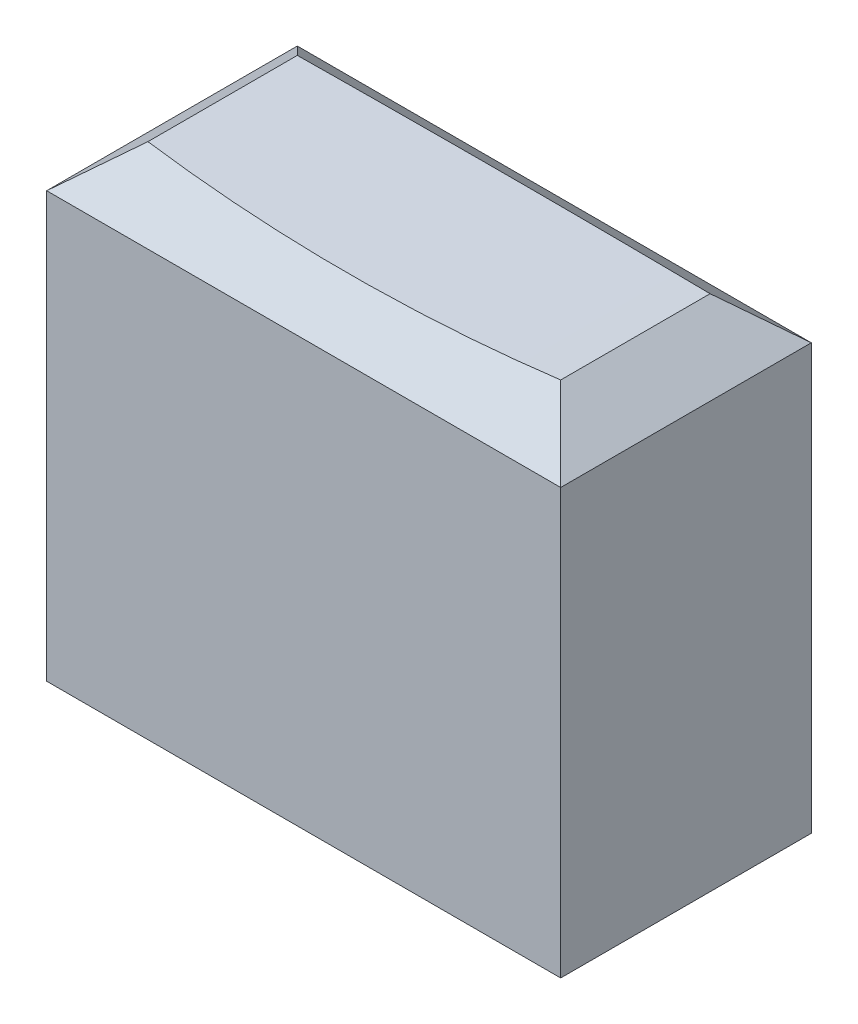
ISO-10303-21;
HEADER;
FILE_DESCRIPTION(('STEP AP214'),'2;1');
FILE_NAME('part.step','',(''),(''),'','','');
FILE_SCHEMA(('AUTOMOTIVE_DESIGN { 1 0 10303 214 1 1 1 1 }'));
ENDSEC;
DATA;
#1=APPLICATION_CONTEXT('core data for automotive mechanical design processes');
#2=APPLICATION_PROTOCOL_DEFINITION('international standard','automotive_design',2000,#1);
#3=PRODUCT_CONTEXT('',#1,'mechanical');
#4=PRODUCT('Part','Part','',(#3));
#5=PRODUCT_RELATED_PRODUCT_CATEGORY('part','',(#4));
#6=PRODUCT_DEFINITION_FORMATION('','',#4);
#7=PRODUCT_DEFINITION_CONTEXT('part definition',#1,'design');
#8=PRODUCT_DEFINITION('design','',#6,#7);
#9=PRODUCT_DEFINITION_SHAPE('','',#8);
#10=(LENGTH_UNIT() NAMED_UNIT(*) SI_UNIT(.MILLI.,.METRE.));
#11=(NAMED_UNIT(*) PLANE_ANGLE_UNIT() SI_UNIT($,.RADIAN.));
#12=(NAMED_UNIT(*) SI_UNIT($,.STERADIAN.) SOLID_ANGLE_UNIT());
#13=UNCERTAINTY_MEASURE_WITH_UNIT(LENGTH_MEASURE(1.E-05),#10,'distance_accuracy_value','');
#14=(GEOMETRIC_REPRESENTATION_CONTEXT(3) GLOBAL_UNCERTAINTY_ASSIGNED_CONTEXT((#13)) GLOBAL_UNIT_ASSIGNED_CONTEXT((#10,
#11,#12)) REPRESENTATION_CONTEXT('',''));
#15=CARTESIAN_POINT('',(0.,0.,0.));
#16=DIRECTION('',(0.,0.,1.));
#17=DIRECTION('',(1.,0.,0.));
#18=AXIS2_PLACEMENT_3D('',#15,#16,#17);
#19=CARTESIAN_POINT('',(-6.05,11.,-2.95));
#20=DIRECTION('',(1.,0.,0.));
#21=DIRECTION('',(0.,0.,-1.));
#22=AXIS2_PLACEMENT_3D('',#19,#20,#21);
#23=PLANE('',#22);
#24=DIRECTION('',(0.,-1.,0.));
#25=VECTOR('',#24,1.);
#26=CARTESIAN_POINT('',(-6.05,11.,2.95));
#27=LINE('',#26,#25);
#28=CARTESIAN_POINT('',(-6.05,10.,2.95));
#29=VERTEX_POINT('',#28);
#30=CARTESIAN_POINT('',(-6.05,0.,2.95));
#31=VERTEX_POINT('',#30);
#32=EDGE_CURVE('E394',#29,#31,#27,.T.);
#33=ORIENTED_EDGE('',*,*,#32,.F.);
#34=DIRECTION('',(0.,0.,-1.));
#35=VECTOR('',#34,1.);
#36=CARTESIAN_POINT('',(-6.05,10.,-2.95));
#37=LINE('',#36,#35);
#38=CARTESIAN_POINT('',(-6.05,10.,-2.95));
#39=VERTEX_POINT('',#38);
#40=EDGE_CURVE('E41',#29,#39,#37,.T.);
#41=ORIENTED_EDGE('',*,*,#40,.T.);
#42=DIRECTION('',(0.,-1.,0.));
#43=VECTOR('',#42,1.);
#44=CARTESIAN_POINT('',(-6.05,11.,-2.95));
#45=LINE('',#44,#43);
#46=CARTESIAN_POINT('',(-6.05,0.,-2.95));
#47=VERTEX_POINT('',#46);
#48=EDGE_CURVE('E388',#39,#47,#45,.T.);
#49=ORIENTED_EDGE('',*,*,#48,.T.);
#50=DIRECTION('',(0.,0.,1.));
#51=VECTOR('',#50,1.);
#52=CARTESIAN_POINT('',(-6.05,0.,-2.95));
#53=LINE('',#52,#51);
#54=EDGE_CURVE('E375',#47,#31,#53,.T.);
#55=ORIENTED_EDGE('',*,*,#54,.T.);
#56=EDGE_LOOP('',(#33,#41,#49,#55));
#57=FACE_BOUND('',#56,.T.);
#58=ADVANCED_FACE('F33',(#57),#23,.F.);
#59=CARTESIAN_POINT('',(-6.05,11.,2.95));
#60=DIRECTION('',(0.,0.,-1.));
#61=DIRECTION('',(-1.,0.,0.));
#62=AXIS2_PLACEMENT_3D('',#59,#60,#61);
#63=PLANE('',#62);
#64=DIRECTION('',(0.,-1.,0.));
#65=VECTOR('',#64,1.);
#66=CARTESIAN_POINT('',(6.05,11.,2.95));
#67=LINE('',#66,#65);
#68=CARTESIAN_POINT('',(6.05,10.,2.95));
#69=VERTEX_POINT('',#68);
#70=CARTESIAN_POINT('',(6.05,0.,2.95));
#71=VERTEX_POINT('',#70);
#72=EDGE_CURVE('E392',#69,#71,#67,.T.);
#73=ORIENTED_EDGE('',*,*,#72,.F.);
#74=DIRECTION('',(-1.,0.,0.));
#75=VECTOR('',#74,1.);
#76=CARTESIAN_POINT('',(-6.05,10.,2.95));
#77=LINE('',#76,#75);
#78=EDGE_CURVE('E56',#69,#29,#77,.T.);
#79=ORIENTED_EDGE('',*,*,#78,.T.);
#80=ORIENTED_EDGE('',*,*,#32,.T.);
#81=DIRECTION('',(1.,0.,0.));
#82=VECTOR('',#81,1.);
#83=CARTESIAN_POINT('',(-6.05,0.,2.95));
#84=LINE('',#83,#82);
#85=EDGE_CURVE('E378',#31,#71,#84,.T.);
#86=ORIENTED_EDGE('',*,*,#85,.T.);
#87=EDGE_LOOP('',(#73,#79,#80,#86));
#88=FACE_BOUND('',#87,.T.);
#89=ADVANCED_FACE('F452',(#88),#63,.F.);
#90=CARTESIAN_POINT('',(6.05,11.,-2.95));
#91=DIRECTION('',(-1.,0.,0.));
#92=DIRECTION('',(0.,0.,1.));
#93=AXIS2_PLACEMENT_3D('',#90,#91,#92);
#94=PLANE('',#93);
#95=DIRECTION('',(0.,-1.,0.));
#96=VECTOR('',#95,1.);
#97=CARTESIAN_POINT('',(6.05,11.,-2.95));
#98=LINE('',#97,#96);
#99=CARTESIAN_POINT('',(6.05,10.,-2.95));
#100=VERTEX_POINT('',#99);
#101=CARTESIAN_POINT('',(6.05,0.,-2.95));
#102=VERTEX_POINT('',#101);
#103=EDGE_CURVE('E390',#100,#102,#98,.T.);
#104=ORIENTED_EDGE('',*,*,#103,.F.);
#105=DIRECTION('',(0.,0.,1.));
#106=VECTOR('',#105,1.);
#107=CARTESIAN_POINT('',(6.05,10.,2.95));
#108=LINE('',#107,#106);
#109=EDGE_CURVE('E403',#100,#69,#108,.T.);
#110=ORIENTED_EDGE('',*,*,#109,.T.);
#111=ORIENTED_EDGE('',*,*,#72,.T.);
#112=DIRECTION('',(0.,0.,-1.));
#113=VECTOR('',#112,1.);
#114=CARTESIAN_POINT('',(6.05,0.,-2.95));
#115=LINE('',#114,#113);
#116=EDGE_CURVE('E382',#71,#102,#115,.T.);
#117=ORIENTED_EDGE('',*,*,#116,.T.);
#118=EDGE_LOOP('',(#104,#110,#111,#117));
#119=FACE_BOUND('',#118,.T.);
#120=ADVANCED_FACE('F457',(#119),#94,.F.);
#121=CARTESIAN_POINT('',(-6.05,11.,-2.95));
#122=DIRECTION('',(0.,0.,1.));
#123=DIRECTION('',(1.,0.,0.));
#124=AXIS2_PLACEMENT_3D('',#121,#122,#123);
#125=PLANE('',#124);
#126=ORIENTED_EDGE('',*,*,#48,.F.);
#127=DIRECTION('',(1.,0.,0.));
#128=VECTOR('',#127,1.);
#129=CARTESIAN_POINT('',(6.05,10.,-2.95));
#130=LINE('',#129,#128);
#131=EDGE_CURVE('E400',#39,#100,#130,.T.);
#132=ORIENTED_EDGE('',*,*,#131,.T.);
#133=ORIENTED_EDGE('',*,*,#103,.T.);
#134=DIRECTION('',(-1.,0.,0.));
#135=VECTOR('',#134,1.);
#136=CARTESIAN_POINT('',(-6.05,0.,-2.95));
#137=LINE('',#136,#135);
#138=EDGE_CURVE('E385',#102,#47,#137,.T.);
#139=ORIENTED_EDGE('',*,*,#138,.T.);
#140=EDGE_LOOP('',(#126,#132,#133,#139));
#141=FACE_BOUND('',#140,.T.);
#142=ADVANCED_FACE('F432',(#141),#125,.F.);
#143=CARTESIAN_POINT('',(0.,0.,0.));
#144=DIRECTION('',(0.,1.,0.));
#145=DIRECTION('',(0.,0.,1.));
#146=AXIS2_PLACEMENT_3D('',#143,#144,#145);
#147=PLANE('',#146);
#148=DIRECTION('',(1.,0.,0.));
#149=VECTOR('',#148,1.);
#150=CARTESIAN_POINT('',(-5.55,0.,-2.45));
#151=LINE('',#150,#149);
#152=CARTESIAN_POINT('',(-5.55,0.,-2.45));
#153=VERTEX_POINT('',#152);
#154=CARTESIAN_POINT('',(-2.05,0.,-2.45));
#155=VERTEX_POINT('',#154);
#156=EDGE_CURVE('E283',#153,#155,#151,.T.);
#157=ORIENTED_EDGE('',*,*,#156,.F.);
#158=DIRECTION('',(0.,0.,-1.));
#159=VECTOR('',#158,1.);
#160=CARTESIAN_POINT('',(-5.55,0.,2.45));
#161=LINE('',#160,#159);
#162=CARTESIAN_POINT('',(-5.55,0.,2.45));
#163=VERTEX_POINT('',#162);
#164=EDGE_CURVE('E48',#163,#153,#161,.T.);
#165=ORIENTED_EDGE('',*,*,#164,.F.);
#166=DIRECTION('',(-1.,0.,0.));
#167=VECTOR('',#166,1.);
#168=CARTESIAN_POINT('',(-5.55,0.,2.45));
#169=LINE('',#168,#167);
#170=CARTESIAN_POINT('',(-2.05,0.,2.45));
#171=VERTEX_POINT('',#170);
#172=EDGE_CURVE('E227',#171,#163,#169,.T.);
#173=ORIENTED_EDGE('',*,*,#172,.F.);
#174=DIRECTION('',(0.,0.,1.));
#175=VECTOR('',#174,1.);
#176=CARTESIAN_POINT('',(-2.05,0.,2.45));
#177=LINE('',#176,#175);
#178=CARTESIAN_POINT('',(-2.05,0.,1.));
#179=VERTEX_POINT('',#178);
#180=EDGE_CURVE('E230',#179,#171,#177,.T.);
#181=ORIENTED_EDGE('',*,*,#180,.F.);
#182=DIRECTION('',(-1.,0.,0.));
#183=VECTOR('',#182,1.);
#184=CARTESIAN_POINT('',(-2.05,0.,1.));
#185=LINE('',#184,#183);
#186=CARTESIAN_POINT('',(-1.65,0.,1.));
#187=VERTEX_POINT('',#186);
#188=EDGE_CURVE('E330',#187,#179,#185,.T.);
#189=ORIENTED_EDGE('',*,*,#188,.F.);
#190=DIRECTION('',(0.,0.,-1.));
#191=VECTOR('',#190,1.);
#192=CARTESIAN_POINT('',(-1.65,0.,1.65));
#193=LINE('',#192,#191);
#194=CARTESIAN_POINT('',(-1.65,0.,1.65));
#195=VERTEX_POINT('',#194);
#196=EDGE_CURVE('E327',#195,#187,#193,.T.);
#197=ORIENTED_EDGE('',*,*,#196,.F.);
#198=DIRECTION('',(-1.,0.,0.));
#199=VECTOR('',#198,1.);
#200=CARTESIAN_POINT('',(-1.65,0.,1.65));
#201=LINE('',#200,#199);
#202=CARTESIAN_POINT('',(1.65,0.,1.65));
#203=VERTEX_POINT('',#202);
#204=EDGE_CURVE('E324',#203,#195,#201,.T.);
#205=ORIENTED_EDGE('',*,*,#204,.F.);
#206=DIRECTION('',(0.,0.,1.));
#207=VECTOR('',#206,1.);
#208=CARTESIAN_POINT('',(1.65,0.,1.65));
#209=LINE('',#208,#207);
#210=CARTESIAN_POINT('',(1.65,0.,1.));
#211=VERTEX_POINT('',#210);
#212=EDGE_CURVE('E321',#211,#203,#209,.T.);
#213=ORIENTED_EDGE('',*,*,#212,.F.);
#214=DIRECTION('',(-1.,0.,0.));
#215=VECTOR('',#214,1.);
#216=CARTESIAN_POINT('',(1.65,0.,1.));
#217=LINE('',#216,#215);
#218=CARTESIAN_POINT('',(2.05,0.,1.));
#219=VERTEX_POINT('',#218);
#220=EDGE_CURVE('E318',#219,#211,#217,.T.);
#221=ORIENTED_EDGE('',*,*,#220,.F.);
#222=DIRECTION('',(0.,0.,-1.));
#223=VECTOR('',#222,1.);
#224=CARTESIAN_POINT('',(2.05,0.,2.45));
#225=LINE('',#224,#223);
#226=CARTESIAN_POINT('',(2.05,0.,2.45));
#227=VERTEX_POINT('',#226);
#228=EDGE_CURVE('E315',#227,#219,#225,.T.);
#229=ORIENTED_EDGE('',*,*,#228,.F.);
#230=DIRECTION('',(-1.,0.,0.));
#231=VECTOR('',#230,1.);
#232=CARTESIAN_POINT('',(2.05,0.,2.45));
#233=LINE('',#232,#231);
#234=CARTESIAN_POINT('',(5.55,0.,2.45));
#235=VERTEX_POINT('',#234);
#236=EDGE_CURVE('E312',#235,#227,#233,.T.);
#237=ORIENTED_EDGE('',*,*,#236,.F.);
#238=DIRECTION('',(0.,0.,1.));
#239=VECTOR('',#238,1.);
#240=CARTESIAN_POINT('',(5.55,0.,2.45));
#241=LINE('',#240,#239);
#242=CARTESIAN_POINT('',(5.55,0.,-2.45));
#243=VERTEX_POINT('',#242);
#244=EDGE_CURVE('E309',#243,#235,#241,.T.);
#245=ORIENTED_EDGE('',*,*,#244,.F.);
#246=DIRECTION('',(1.,0.,0.));
#247=VECTOR('',#246,1.);
#248=CARTESIAN_POINT('',(2.05,0.,-2.45));
#249=LINE('',#248,#247);
#250=CARTESIAN_POINT('',(2.05,0.,-2.45));
#251=VERTEX_POINT('',#250);
#252=EDGE_CURVE('E306',#251,#243,#249,.T.);
#253=ORIENTED_EDGE('',*,*,#252,.F.);
#254=DIRECTION('',(0.,0.,-1.));
#255=VECTOR('',#254,1.);
#256=CARTESIAN_POINT('',(2.05,0.,-1.));
#257=LINE('',#256,#255);
#258=CARTESIAN_POINT('',(2.05,0.,-1.));
#259=VERTEX_POINT('',#258);
#260=EDGE_CURVE('E303',#259,#251,#257,.T.);
#261=ORIENTED_EDGE('',*,*,#260,.F.);
#262=DIRECTION('',(1.,0.,0.));
#263=VECTOR('',#262,1.);
#264=CARTESIAN_POINT('',(1.65,0.,-1.));
#265=LINE('',#264,#263);
#266=CARTESIAN_POINT('',(1.65,0.,-1.));
#267=VERTEX_POINT('',#266);
#268=EDGE_CURVE('E300',#267,#259,#265,.T.);
#269=ORIENTED_EDGE('',*,*,#268,.F.);
#270=DIRECTION('',(0.,0.,1.));
#271=VECTOR('',#270,1.);
#272=CARTESIAN_POINT('',(1.65,0.,-1.));
#273=LINE('',#272,#271);
#274=CARTESIAN_POINT('',(1.65,0.,-1.65));
#275=VERTEX_POINT('',#274);
#276=EDGE_CURVE('E297',#275,#267,#273,.T.);
#277=ORIENTED_EDGE('',*,*,#276,.F.);
#278=DIRECTION('',(1.,0.,0.));
#279=VECTOR('',#278,1.);
#280=CARTESIAN_POINT('',(-1.65,0.,-1.65));
#281=LINE('',#280,#279);
#282=CARTESIAN_POINT('',(-1.65,0.,-1.65));
#283=VERTEX_POINT('',#282);
#284=EDGE_CURVE('E294',#283,#275,#281,.T.);
#285=ORIENTED_EDGE('',*,*,#284,.F.);
#286=DIRECTION('',(0.,0.,-1.));
#287=VECTOR('',#286,1.);
#288=CARTESIAN_POINT('',(-1.65,0.,-1.));
#289=LINE('',#288,#287);
#290=CARTESIAN_POINT('',(-1.65,0.,-1.));
#291=VERTEX_POINT('',#290);
#292=EDGE_CURVE('E291',#291,#283,#289,.T.);
#293=ORIENTED_EDGE('',*,*,#292,.F.);
#294=DIRECTION('',(1.,0.,0.));
#295=VECTOR('',#294,1.);
#296=CARTESIAN_POINT('',(-2.05,0.,-1.));
#297=LINE('',#296,#295);
#298=CARTESIAN_POINT('',(-2.05,0.,-1.));
#299=VERTEX_POINT('',#298);
#300=EDGE_CURVE('E288',#299,#291,#297,.T.);
#301=ORIENTED_EDGE('',*,*,#300,.F.);
#302=DIRECTION('',(0.,0.,1.));
#303=VECTOR('',#302,1.);
#304=CARTESIAN_POINT('',(-2.05,0.,-1.));
#305=LINE('',#304,#303);
#306=EDGE_CURVE('E285',#155,#299,#305,.T.);
#307=ORIENTED_EDGE('',*,*,#306,.F.);
#308=EDGE_LOOP('',(#157,#165,#173,#181,#189,#197,#205,#213,#221,#229,#237,#245,#253,#261,#269,
#277,#285,#293,#301,#307));
#309=FACE_BOUND('',#308,.T.);
#310=ORIENTED_EDGE('',*,*,#54,.F.);
#311=ORIENTED_EDGE('',*,*,#138,.F.);
#312=ORIENTED_EDGE('',*,*,#116,.F.);
#313=ORIENTED_EDGE('',*,*,#85,.F.);
#314=EDGE_LOOP('',(#310,#311,#312,#313));
#315=FACE_BOUND('',#314,.T.);
#316=ADVANCED_FACE('F466',(#309,#315),#147,.F.);
#317=CARTESIAN_POINT('',(0.,11.,1.75824640740579));
#318=DIRECTION('',(0.,0.766044443118976,0.642787609686541));
#319=DIRECTION('',(-1.,0.,0.));
#320=AXIS2_PLACEMENT_3D('',#317,#318,#319);
#321=PLANE('',#320);
#322=CARTESIAN_POINT('',(0.,89.6001938502372,-91.9138169922152));
#323=DIRECTION('',(0.,0.766044443118976,0.642787609686541));
#324=DIRECTION('',(0.,-0.642787609686541,0.766044443118976));
#325=AXIS2_PLACEMENT_3D('',#322,#323,#324);
#326=ELLIPSE('',#325,122.51355294269,78.7501938502372);
#327=CARTESIAN_POINT('',(-4.85824640740579,11.,1.7582464074058));
#328=VERTEX_POINT('',#327);
#329=CARTESIAN_POINT('',(4.85824640740579,11.,1.7582464074058));
#330=VERTEX_POINT('',#329);
#331=EDGE_CURVE('E337',#328,#330,#326,.T.);
#332=ORIENTED_EDGE('',*,*,#331,.F.);
#333=DIRECTION('',(0.608120402411342,0.510273605374739,-0.608120402411342));
#334=VECTOR('',#333,1.);
#335=CARTESIAN_POINT('',(-4.20802855828736,11.5455975573802,1.10802855828736));
#336=LINE('',#335,#334);
#337=EDGE_CURVE('E411',#29,#328,#336,.T.);
#338=ORIENTED_EDGE('',*,*,#337,.F.);
#339=ORIENTED_EDGE('',*,*,#78,.F.);
#340=DIRECTION('',(-0.608120402411342,0.510273605374739,-0.608120402411342));
#341=VECTOR('',#340,1.);
#342=CARTESIAN_POINT('',(3.06161624441767,12.5075517071253,-0.038383755582331));
#343=LINE('',#342,#341);
#344=EDGE_CURVE('E379',#330,#69,#343,.F.);
#345=ORIENTED_EDGE('',*,*,#344,.F.);
#346=EDGE_LOOP('',(#332,#338,#339,#345));
#347=FACE_BOUND('',#346,.T.);
#348=ADVANCED_FACE('F35',(#347),#321,.T.);
#349=CARTESIAN_POINT('',(4.85824640740579,11.,0.));
#350=DIRECTION('',(0.642787609686541,0.766044443118976,0.));
#351=DIRECTION('',(0.,0.,1.));
#352=AXIS2_PLACEMENT_3D('',#349,#350,#351);
#353=PLANE('',#352);
#354=ORIENTED_EDGE('',*,*,#344,.T.);
#355=ORIENTED_EDGE('',*,*,#109,.F.);
#356=DIRECTION('',(-0.608120402411342,0.510273605374739,0.608120402411342));
#357=VECTOR('',#356,1.);
#358=CARTESIAN_POINT('',(4.20802855828736,11.5455975573802,-1.10802855828736));
#359=LINE('',#358,#357);
#360=CARTESIAN_POINT('',(4.85824640740579,11.,-1.75824640740579));
#361=VERTEX_POINT('',#360);
#362=EDGE_CURVE('E409',#361,#100,#359,.F.);
#363=ORIENTED_EDGE('',*,*,#362,.F.);
#364=DIRECTION('',(0.,0.,-1.));
#365=VECTOR('',#364,1.);
#366=CARTESIAN_POINT('',(4.85824640740579,11.,-2.95));
#367=LINE('',#366,#365);
#368=EDGE_CURVE('E398',#330,#361,#367,.T.);
#369=ORIENTED_EDGE('',*,*,#368,.F.);
#370=EDGE_LOOP('',(#354,#355,#363,#369));
#371=FACE_BOUND('',#370,.T.);
#372=ADVANCED_FACE('F418',(#371),#353,.T.);
#373=CARTESIAN_POINT('',(-4.85824640740579,11.,0.));
#374=DIRECTION('',(-0.642787609686541,0.766044443118976,0.));
#375=DIRECTION('',(0.,0.,-1.));
#376=AXIS2_PLACEMENT_3D('',#373,#374,#375);
#377=PLANE('',#376);
#378=ORIENTED_EDGE('',*,*,#337,.T.);
#379=DIRECTION('',(0.,0.,1.));
#380=VECTOR('',#379,1.);
#381=CARTESIAN_POINT('',(-4.85824640740579,11.,2.95));
#382=LINE('',#381,#380);
#383=CARTESIAN_POINT('',(-4.85824640740579,11.,-1.75824640740579));
#384=VERTEX_POINT('',#383);
#385=EDGE_CURVE('E396',#384,#328,#382,.T.);
#386=ORIENTED_EDGE('',*,*,#385,.F.);
#387=DIRECTION('',(-0.608120402411342,-0.510273605374739,-0.608120402411342));
#388=VECTOR('',#387,1.);
#389=CARTESIAN_POINT('',(-4.20802855828736,11.5455975573802,-1.10802855828736));
#390=LINE('',#389,#388);
#391=EDGE_CURVE('E374',#39,#384,#390,.F.);
#392=ORIENTED_EDGE('',*,*,#391,.F.);
#393=ORIENTED_EDGE('',*,*,#40,.F.);
#394=EDGE_LOOP('',(#378,#386,#392,#393));
#395=FACE_BOUND('',#394,.T.);
#396=ADVANCED_FACE('F427',(#395),#377,.T.);
#397=CARTESIAN_POINT('',(0.,11.,-1.75824640740579));
#398=DIRECTION('',(0.,0.766044443118976,-0.642787609686541));
#399=DIRECTION('',(1.,0.,0.));
#400=AXIS2_PLACEMENT_3D('',#397,#398,#399);
#401=PLANE('',#400);
#402=CARTESIAN_POINT('',(0.,89.6001938502372,91.9138169922152));
#403=DIRECTION('',(0.,0.766044443118976,-0.642787609686541));
#404=DIRECTION('',(0.,0.642787609686541,0.766044443118976));
#405=AXIS2_PLACEMENT_3D('',#402,#403,#404);
#406=ELLIPSE('',#405,122.51355294269,78.7501938502372);
#407=EDGE_CURVE('E11',#361,#384,#406,.T.);
#408=ORIENTED_EDGE('',*,*,#407,.F.);
#409=ORIENTED_EDGE('',*,*,#362,.T.);
#410=ORIENTED_EDGE('',*,*,#131,.F.);
#411=ORIENTED_EDGE('',*,*,#391,.T.);
#412=EDGE_LOOP('',(#408,#409,#410,#411));
#413=FACE_BOUND('',#412,.T.);
#414=ADVANCED_FACE('F438',(#413),#401,.T.);
#415=CARTESIAN_POINT('',(0.,89.6001938502372,-2.95));
#416=DIRECTION('',(0.,0.,1.));
#417=DIRECTION('',(1.,0.,0.));
#418=AXIS2_PLACEMENT_3D('',#415,#416,#417);
#419=CYLINDRICAL_SURFACE('',#418,78.7501938502372);
#420=ORIENTED_EDGE('',*,*,#331,.T.);
#421=ORIENTED_EDGE('',*,*,#368,.T.);
#422=ORIENTED_EDGE('',*,*,#407,.T.);
#423=ORIENTED_EDGE('',*,*,#385,.T.);
#424=EDGE_LOOP('',(#420,#421,#422,#423));
#425=FACE_BOUND('',#424,.T.);
#426=ADVANCED_FACE('F440',(#425),#419,.F.);
#427=CARTESIAN_POINT('',(-5.55,9.,2.45));
#428=DIRECTION('',(-1.,0.,0.));
#429=DIRECTION('',(0.,0.,1.));
#430=AXIS2_PLACEMENT_3D('',#427,#428,#429);
#431=PLANE('',#430);
#432=ORIENTED_EDGE('',*,*,#164,.T.);
#433=DIRECTION('',(0.,-1.,0.));
#434=VECTOR('',#433,1.);
#435=CARTESIAN_POINT('',(-5.55,9.,-2.45));
#436=LINE('',#435,#434);
#437=CARTESIAN_POINT('',(-5.55,9.,-2.45));
#438=VERTEX_POINT('',#437);
#439=EDGE_CURVE('E204',#438,#153,#436,.T.);
#440=ORIENTED_EDGE('',*,*,#439,.F.);
#441=DIRECTION('',(0.,0.,-1.));
#442=VECTOR('',#441,1.);
#443=CARTESIAN_POINT('',(-5.55,9.,2.45));
#444=LINE('',#443,#442);
#445=CARTESIAN_POINT('',(-5.55,9.,2.45));
#446=VERTEX_POINT('',#445);
#447=EDGE_CURVE('E208',#446,#438,#444,.T.);
#448=ORIENTED_EDGE('',*,*,#447,.F.);
#449=DIRECTION('',(0.,-1.,0.));
#450=VECTOR('',#449,1.);
#451=CARTESIAN_POINT('',(-5.55,9.,2.45));
#452=LINE('',#451,#450);
#453=EDGE_CURVE('E335',#446,#163,#452,.T.);
#454=ORIENTED_EDGE('',*,*,#453,.T.);
#455=EDGE_LOOP('',(#432,#440,#448,#454));
#456=FACE_BOUND('',#455,.T.);
#457=ADVANCED_FACE('F206',(#456),#431,.F.);
#458=CARTESIAN_POINT('',(-5.55,9.,2.45));
#459=DIRECTION('',(0.,0.,1.));
#460=DIRECTION('',(1.,0.,0.));
#461=AXIS2_PLACEMENT_3D('',#458,#459,#460);
#462=PLANE('',#461);
#463=ORIENTED_EDGE('',*,*,#172,.T.);
#464=ORIENTED_EDGE('',*,*,#453,.F.);
#465=DIRECTION('',(-1.,0.,0.));
#466=VECTOR('',#465,1.);
#467=CARTESIAN_POINT('',(-5.55,9.,2.45));
#468=LINE('',#467,#466);
#469=CARTESIAN_POINT('',(-2.05,9.,2.45));
#470=VERTEX_POINT('',#469);
#471=EDGE_CURVE('E214',#470,#446,#468,.T.);
#472=ORIENTED_EDGE('',*,*,#471,.F.);
#473=DIRECTION('',(0.,-1.,0.));
#474=VECTOR('',#473,1.);
#475=CARTESIAN_POINT('',(-2.05,9.,2.45));
#476=LINE('',#475,#474);
#477=EDGE_CURVE('E338',#470,#171,#476,.T.);
#478=ORIENTED_EDGE('',*,*,#477,.T.);
#479=EDGE_LOOP('',(#463,#464,#472,#478));
#480=FACE_BOUND('',#479,.T.);
#481=ADVANCED_FACE('F447',(#480),#462,.F.);
#482=CARTESIAN_POINT('',(-2.05,9.,2.45));
#483=DIRECTION('',(1.,0.,0.));
#484=DIRECTION('',(0.,0.,-1.));
#485=AXIS2_PLACEMENT_3D('',#482,#483,#484);
#486=PLANE('',#485);
#487=ORIENTED_EDGE('',*,*,#180,.T.);
#488=ORIENTED_EDGE('',*,*,#477,.F.);
#489=DIRECTION('',(0.,0.,1.));
#490=VECTOR('',#489,1.);
#491=CARTESIAN_POINT('',(-2.05,9.,2.45));
#492=LINE('',#491,#490);
#493=CARTESIAN_POINT('',(-2.05,9.,1.));
#494=VERTEX_POINT('',#493);
#495=EDGE_CURVE('E279',#494,#470,#492,.T.);
#496=ORIENTED_EDGE('',*,*,#495,.F.);
#497=DIRECTION('',(0.,-1.,0.));
#498=VECTOR('',#497,1.);
#499=CARTESIAN_POINT('',(-2.05,9.,1.));
#500=LINE('',#499,#498);
#501=EDGE_CURVE('E340',#494,#179,#500,.T.);
#502=ORIENTED_EDGE('',*,*,#501,.T.);
#503=EDGE_LOOP('',(#487,#488,#496,#502));
#504=FACE_BOUND('',#503,.T.);
#505=ADVANCED_FACE('F531',(#504),#486,.F.);
#506=CARTESIAN_POINT('',(-2.05,9.,1.));
#507=DIRECTION('',(0.,0.,1.));
#508=DIRECTION('',(1.,0.,0.));
#509=AXIS2_PLACEMENT_3D('',#506,#507,#508);
#510=PLANE('',#509);
#511=ORIENTED_EDGE('',*,*,#188,.T.);
#512=ORIENTED_EDGE('',*,*,#501,.F.);
#513=DIRECTION('',(-1.,0.,0.));
#514=VECTOR('',#513,1.);
#515=CARTESIAN_POINT('',(-2.05,9.,1.));
#516=LINE('',#515,#514);
#517=CARTESIAN_POINT('',(-1.65,9.,1.));
#518=VERTEX_POINT('',#517);
#519=EDGE_CURVE('E276',#518,#494,#516,.T.);
#520=ORIENTED_EDGE('',*,*,#519,.F.);
#521=DIRECTION('',(0.,-1.,0.));
#522=VECTOR('',#521,1.);
#523=CARTESIAN_POINT('',(-1.65,9.,1.));
#524=LINE('',#523,#522);
#525=EDGE_CURVE('E342',#518,#187,#524,.T.);
#526=ORIENTED_EDGE('',*,*,#525,.T.);
#527=EDGE_LOOP('',(#511,#512,#520,#526));
#528=FACE_BOUND('',#527,.T.);
#529=ADVANCED_FACE('F541',(#528),#510,.F.);
#530=CARTESIAN_POINT('',(-1.65,9.,1.65));
#531=DIRECTION('',(-1.,0.,0.));
#532=DIRECTION('',(0.,0.,1.));
#533=AXIS2_PLACEMENT_3D('',#530,#531,#532);
#534=PLANE('',#533);
#535=ORIENTED_EDGE('',*,*,#196,.T.);
#536=ORIENTED_EDGE('',*,*,#525,.F.);
#537=DIRECTION('',(0.,0.,-1.));
#538=VECTOR('',#537,1.);
#539=CARTESIAN_POINT('',(-1.65,9.,1.65));
#540=LINE('',#539,#538);
#541=CARTESIAN_POINT('',(-1.65,9.,1.65));
#542=VERTEX_POINT('',#541);
#543=EDGE_CURVE('E273',#542,#518,#540,.T.);
#544=ORIENTED_EDGE('',*,*,#543,.F.);
#545=DIRECTION('',(0.,-1.,0.));
#546=VECTOR('',#545,1.);
#547=CARTESIAN_POINT('',(-1.65,9.,1.65));
#548=LINE('',#547,#546);
#549=EDGE_CURVE('E344',#542,#195,#548,.T.);
#550=ORIENTED_EDGE('',*,*,#549,.T.);
#551=EDGE_LOOP('',(#535,#536,#544,#550));
#552=FACE_BOUND('',#551,.T.);
#553=ADVANCED_FACE('F551',(#552),#534,.F.);
#554=CARTESIAN_POINT('',(-1.65,9.,1.65));
#555=DIRECTION('',(0.,0.,1.));
#556=DIRECTION('',(1.,0.,0.));
#557=AXIS2_PLACEMENT_3D('',#554,#555,#556);
#558=PLANE('',#557);
#559=ORIENTED_EDGE('',*,*,#204,.T.);
#560=ORIENTED_EDGE('',*,*,#549,.F.);
#561=DIRECTION('',(-1.,0.,0.));
#562=VECTOR('',#561,1.);
#563=CARTESIAN_POINT('',(-1.65,9.,1.65));
#564=LINE('',#563,#562);
#565=CARTESIAN_POINT('',(1.65,9.,1.65));
#566=VERTEX_POINT('',#565);
#567=EDGE_CURVE('E270',#566,#542,#564,.T.);
#568=ORIENTED_EDGE('',*,*,#567,.F.);
#569=DIRECTION('',(0.,-1.,0.));
#570=VECTOR('',#569,1.);
#571=CARTESIAN_POINT('',(1.65,9.,1.65));
#572=LINE('',#571,#570);
#573=EDGE_CURVE('E346',#566,#203,#572,.T.);
#574=ORIENTED_EDGE('',*,*,#573,.T.);
#575=EDGE_LOOP('',(#559,#560,#568,#574));
#576=FACE_BOUND('',#575,.T.);
#577=ADVANCED_FACE('F561',(#576),#558,.F.);
#578=CARTESIAN_POINT('',(1.65,9.,1.65));
#579=DIRECTION('',(1.,0.,0.));
#580=DIRECTION('',(0.,0.,-1.));
#581=AXIS2_PLACEMENT_3D('',#578,#579,#580);
#582=PLANE('',#581);
#583=ORIENTED_EDGE('',*,*,#212,.T.);
#584=ORIENTED_EDGE('',*,*,#573,.F.);
#585=DIRECTION('',(0.,0.,1.));
#586=VECTOR('',#585,1.);
#587=CARTESIAN_POINT('',(1.65,9.,1.65));
#588=LINE('',#587,#586);
#589=CARTESIAN_POINT('',(1.65,9.,1.));
#590=VERTEX_POINT('',#589);
#591=EDGE_CURVE('E267',#590,#566,#588,.T.);
#592=ORIENTED_EDGE('',*,*,#591,.F.);
#593=DIRECTION('',(0.,-1.,0.));
#594=VECTOR('',#593,1.);
#595=CARTESIAN_POINT('',(1.65,9.,1.));
#596=LINE('',#595,#594);
#597=EDGE_CURVE('E348',#590,#211,#596,.T.);
#598=ORIENTED_EDGE('',*,*,#597,.T.);
#599=EDGE_LOOP('',(#583,#584,#592,#598));
#600=FACE_BOUND('',#599,.T.);
#601=ADVANCED_FACE('F571',(#600),#582,.F.);
#602=CARTESIAN_POINT('',(1.65,9.,1.));
#603=DIRECTION('',(0.,0.,1.));
#604=DIRECTION('',(1.,0.,0.));
#605=AXIS2_PLACEMENT_3D('',#602,#603,#604);
#606=PLANE('',#605);
#607=ORIENTED_EDGE('',*,*,#220,.T.);
#608=ORIENTED_EDGE('',*,*,#597,.F.);
#609=DIRECTION('',(-1.,0.,0.));
#610=VECTOR('',#609,1.);
#611=CARTESIAN_POINT('',(1.65,9.,1.));
#612=LINE('',#611,#610);
#613=CARTESIAN_POINT('',(2.05,9.,1.));
#614=VERTEX_POINT('',#613);
#615=EDGE_CURVE('E264',#614,#590,#612,.T.);
#616=ORIENTED_EDGE('',*,*,#615,.F.);
#617=DIRECTION('',(0.,-1.,0.));
#618=VECTOR('',#617,1.);
#619=CARTESIAN_POINT('',(2.05,9.,1.));
#620=LINE('',#619,#618);
#621=EDGE_CURVE('E350',#614,#219,#620,.T.);
#622=ORIENTED_EDGE('',*,*,#621,.T.);
#623=EDGE_LOOP('',(#607,#608,#616,#622));
#624=FACE_BOUND('',#623,.T.);
#625=ADVANCED_FACE('F581',(#624),#606,.F.);
#626=CARTESIAN_POINT('',(2.05,9.,2.45));
#627=DIRECTION('',(-1.,0.,0.));
#628=DIRECTION('',(0.,0.,1.));
#629=AXIS2_PLACEMENT_3D('',#626,#627,#628);
#630=PLANE('',#629);
#631=ORIENTED_EDGE('',*,*,#228,.T.);
#632=ORIENTED_EDGE('',*,*,#621,.F.);
#633=DIRECTION('',(0.,0.,-1.));
#634=VECTOR('',#633,1.);
#635=CARTESIAN_POINT('',(2.05,9.,2.45));
#636=LINE('',#635,#634);
#637=CARTESIAN_POINT('',(2.05,9.,2.45));
#638=VERTEX_POINT('',#637);
#639=EDGE_CURVE('E261',#638,#614,#636,.T.);
#640=ORIENTED_EDGE('',*,*,#639,.F.);
#641=DIRECTION('',(0.,-1.,0.));
#642=VECTOR('',#641,1.);
#643=CARTESIAN_POINT('',(2.05,9.,2.45));
#644=LINE('',#643,#642);
#645=EDGE_CURVE('E352',#638,#227,#644,.T.);
#646=ORIENTED_EDGE('',*,*,#645,.T.);
#647=EDGE_LOOP('',(#631,#632,#640,#646));
#648=FACE_BOUND('',#647,.T.);
#649=ADVANCED_FACE('F591',(#648),#630,.F.);
#650=CARTESIAN_POINT('',(2.05,9.,2.45));
#651=DIRECTION('',(0.,0.,1.));
#652=DIRECTION('',(1.,0.,0.));
#653=AXIS2_PLACEMENT_3D('',#650,#651,#652);
#654=PLANE('',#653);
#655=ORIENTED_EDGE('',*,*,#236,.T.);
#656=ORIENTED_EDGE('',*,*,#645,.F.);
#657=DIRECTION('',(-1.,0.,0.));
#658=VECTOR('',#657,1.);
#659=CARTESIAN_POINT('',(2.05,9.,2.45));
#660=LINE('',#659,#658);
#661=CARTESIAN_POINT('',(5.55,9.,2.45));
#662=VERTEX_POINT('',#661);
#663=EDGE_CURVE('E258',#662,#638,#660,.T.);
#664=ORIENTED_EDGE('',*,*,#663,.F.);
#665=DIRECTION('',(0.,-1.,0.));
#666=VECTOR('',#665,1.);
#667=CARTESIAN_POINT('',(5.55,9.,2.45));
#668=LINE('',#667,#666);
#669=EDGE_CURVE('E354',#662,#235,#668,.T.);
#670=ORIENTED_EDGE('',*,*,#669,.T.);
#671=EDGE_LOOP('',(#655,#656,#664,#670));
#672=FACE_BOUND('',#671,.T.);
#673=ADVANCED_FACE('F601',(#672),#654,.F.);
#674=CARTESIAN_POINT('',(5.55,9.,2.45));
#675=DIRECTION('',(1.,0.,0.));
#676=DIRECTION('',(0.,0.,-1.));
#677=AXIS2_PLACEMENT_3D('',#674,#675,#676);
#678=PLANE('',#677);
#679=ORIENTED_EDGE('',*,*,#244,.T.);
#680=ORIENTED_EDGE('',*,*,#669,.F.);
#681=DIRECTION('',(0.,0.,1.));
#682=VECTOR('',#681,1.);
#683=CARTESIAN_POINT('',(5.55,9.,2.45));
#684=LINE('',#683,#682);
#685=CARTESIAN_POINT('',(5.55,9.,-2.45));
#686=VERTEX_POINT('',#685);
#687=EDGE_CURVE('E255',#686,#662,#684,.T.);
#688=ORIENTED_EDGE('',*,*,#687,.F.);
#689=DIRECTION('',(0.,-1.,0.));
#690=VECTOR('',#689,1.);
#691=CARTESIAN_POINT('',(5.55,9.,-2.45));
#692=LINE('',#691,#690);
#693=EDGE_CURVE('E356',#686,#243,#692,.T.);
#694=ORIENTED_EDGE('',*,*,#693,.T.);
#695=EDGE_LOOP('',(#679,#680,#688,#694));
#696=FACE_BOUND('',#695,.T.);
#697=ADVANCED_FACE('F611',(#696),#678,.F.);
#698=CARTESIAN_POINT('',(2.05,9.,-2.45));
#699=DIRECTION('',(0.,0.,-1.));
#700=DIRECTION('',(-1.,0.,0.));
#701=AXIS2_PLACEMENT_3D('',#698,#699,#700);
#702=PLANE('',#701);
#703=ORIENTED_EDGE('',*,*,#252,.T.);
#704=ORIENTED_EDGE('',*,*,#693,.F.);
#705=DIRECTION('',(1.,0.,0.));
#706=VECTOR('',#705,1.);
#707=CARTESIAN_POINT('',(2.05,9.,-2.45));
#708=LINE('',#707,#706);
#709=CARTESIAN_POINT('',(2.05,9.,-2.45));
#710=VERTEX_POINT('',#709);
#711=EDGE_CURVE('E252',#710,#686,#708,.T.);
#712=ORIENTED_EDGE('',*,*,#711,.F.);
#713=DIRECTION('',(0.,-1.,0.));
#714=VECTOR('',#713,1.);
#715=CARTESIAN_POINT('',(2.05,9.,-2.45));
#716=LINE('',#715,#714);
#717=EDGE_CURVE('E358',#710,#251,#716,.T.);
#718=ORIENTED_EDGE('',*,*,#717,.T.);
#719=EDGE_LOOP('',(#703,#704,#712,#718));
#720=FACE_BOUND('',#719,.T.);
#721=ADVANCED_FACE('F621',(#720),#702,.F.);
#722=CARTESIAN_POINT('',(2.05,9.,-1.));
#723=DIRECTION('',(-1.,0.,0.));
#724=DIRECTION('',(0.,0.,1.));
#725=AXIS2_PLACEMENT_3D('',#722,#723,#724);
#726=PLANE('',#725);
#727=ORIENTED_EDGE('',*,*,#260,.T.);
#728=ORIENTED_EDGE('',*,*,#717,.F.);
#729=DIRECTION('',(0.,0.,-1.));
#730=VECTOR('',#729,1.);
#731=CARTESIAN_POINT('',(2.05,9.,-1.));
#732=LINE('',#731,#730);
#733=CARTESIAN_POINT('',(2.05,9.,-1.));
#734=VERTEX_POINT('',#733);
#735=EDGE_CURVE('E249',#734,#710,#732,.T.);
#736=ORIENTED_EDGE('',*,*,#735,.F.);
#737=DIRECTION('',(0.,-1.,0.));
#738=VECTOR('',#737,1.);
#739=CARTESIAN_POINT('',(2.05,9.,-1.));
#740=LINE('',#739,#738);
#741=EDGE_CURVE('E360',#734,#259,#740,.T.);
#742=ORIENTED_EDGE('',*,*,#741,.T.);
#743=EDGE_LOOP('',(#727,#728,#736,#742));
#744=FACE_BOUND('',#743,.T.);
#745=ADVANCED_FACE('F631',(#744),#726,.F.);
#746=CARTESIAN_POINT('',(1.65,9.,-1.));
#747=DIRECTION('',(0.,0.,-1.));
#748=DIRECTION('',(-1.,0.,0.));
#749=AXIS2_PLACEMENT_3D('',#746,#747,#748);
#750=PLANE('',#749);
#751=ORIENTED_EDGE('',*,*,#268,.T.);
#752=ORIENTED_EDGE('',*,*,#741,.F.);
#753=DIRECTION('',(1.,0.,0.));
#754=VECTOR('',#753,1.);
#755=CARTESIAN_POINT('',(1.65,9.,-1.));
#756=LINE('',#755,#754);
#757=CARTESIAN_POINT('',(1.65,9.,-1.));
#758=VERTEX_POINT('',#757);
#759=EDGE_CURVE('E246',#758,#734,#756,.T.);
#760=ORIENTED_EDGE('',*,*,#759,.F.);
#761=DIRECTION('',(0.,-1.,0.));
#762=VECTOR('',#761,1.);
#763=CARTESIAN_POINT('',(1.65,9.,-1.));
#764=LINE('',#763,#762);
#765=EDGE_CURVE('E362',#758,#267,#764,.T.);
#766=ORIENTED_EDGE('',*,*,#765,.T.);
#767=EDGE_LOOP('',(#751,#752,#760,#766));
#768=FACE_BOUND('',#767,.T.);
#769=ADVANCED_FACE('F641',(#768),#750,.F.);
#770=CARTESIAN_POINT('',(1.65,9.,-1.));
#771=DIRECTION('',(1.,0.,0.));
#772=DIRECTION('',(0.,0.,-1.));
#773=AXIS2_PLACEMENT_3D('',#770,#771,#772);
#774=PLANE('',#773);
#775=ORIENTED_EDGE('',*,*,#276,.T.);
#776=ORIENTED_EDGE('',*,*,#765,.F.);
#777=DIRECTION('',(0.,0.,1.));
#778=VECTOR('',#777,1.);
#779=CARTESIAN_POINT('',(1.65,9.,-1.));
#780=LINE('',#779,#778);
#781=CARTESIAN_POINT('',(1.65,9.,-1.65));
#782=VERTEX_POINT('',#781);
#783=EDGE_CURVE('E243',#782,#758,#780,.T.);
#784=ORIENTED_EDGE('',*,*,#783,.F.);
#785=DIRECTION('',(0.,-1.,0.));
#786=VECTOR('',#785,1.);
#787=CARTESIAN_POINT('',(1.65,9.,-1.65));
#788=LINE('',#787,#786);
#789=EDGE_CURVE('E364',#782,#275,#788,.T.);
#790=ORIENTED_EDGE('',*,*,#789,.T.);
#791=EDGE_LOOP('',(#775,#776,#784,#790));
#792=FACE_BOUND('',#791,.T.);
#793=ADVANCED_FACE('F651',(#792),#774,.F.);
#794=CARTESIAN_POINT('',(-1.65,9.,-1.65));
#795=DIRECTION('',(0.,0.,-1.));
#796=DIRECTION('',(-1.,0.,0.));
#797=AXIS2_PLACEMENT_3D('',#794,#795,#796);
#798=PLANE('',#797);
#799=ORIENTED_EDGE('',*,*,#284,.T.);
#800=ORIENTED_EDGE('',*,*,#789,.F.);
#801=DIRECTION('',(1.,0.,0.));
#802=VECTOR('',#801,1.);
#803=CARTESIAN_POINT('',(-1.65,9.,-1.65));
#804=LINE('',#803,#802);
#805=CARTESIAN_POINT('',(-1.65,9.,-1.65));
#806=VERTEX_POINT('',#805);
#807=EDGE_CURVE('E240',#806,#782,#804,.T.);
#808=ORIENTED_EDGE('',*,*,#807,.F.);
#809=DIRECTION('',(0.,-1.,0.));
#810=VECTOR('',#809,1.);
#811=CARTESIAN_POINT('',(-1.65,9.,-1.65));
#812=LINE('',#811,#810);
#813=EDGE_CURVE('E366',#806,#283,#812,.T.);
#814=ORIENTED_EDGE('',*,*,#813,.T.);
#815=EDGE_LOOP('',(#799,#800,#808,#814));
#816=FACE_BOUND('',#815,.T.);
#817=ADVANCED_FACE('F661',(#816),#798,.F.);
#818=CARTESIAN_POINT('',(-1.65,9.,-1.));
#819=DIRECTION('',(-1.,0.,0.));
#820=DIRECTION('',(0.,0.,1.));
#821=AXIS2_PLACEMENT_3D('',#818,#819,#820);
#822=PLANE('',#821);
#823=ORIENTED_EDGE('',*,*,#292,.T.);
#824=ORIENTED_EDGE('',*,*,#813,.F.);
#825=DIRECTION('',(0.,0.,-1.));
#826=VECTOR('',#825,1.);
#827=CARTESIAN_POINT('',(-1.65,9.,-1.));
#828=LINE('',#827,#826);
#829=CARTESIAN_POINT('',(-1.65,9.,-1.));
#830=VERTEX_POINT('',#829);
#831=EDGE_CURVE('E237',#830,#806,#828,.T.);
#832=ORIENTED_EDGE('',*,*,#831,.F.);
#833=DIRECTION('',(0.,-1.,0.));
#834=VECTOR('',#833,1.);
#835=CARTESIAN_POINT('',(-1.65,9.,-1.));
#836=LINE('',#835,#834);
#837=EDGE_CURVE('E368',#830,#291,#836,.T.);
#838=ORIENTED_EDGE('',*,*,#837,.T.);
#839=EDGE_LOOP('',(#823,#824,#832,#838));
#840=FACE_BOUND('',#839,.T.);
#841=ADVANCED_FACE('F671',(#840),#822,.F.);
#842=CARTESIAN_POINT('',(-2.05,9.,-1.));
#843=DIRECTION('',(0.,0.,-1.));
#844=DIRECTION('',(-1.,0.,0.));
#845=AXIS2_PLACEMENT_3D('',#842,#843,#844);
#846=PLANE('',#845);
#847=ORIENTED_EDGE('',*,*,#300,.T.);
#848=ORIENTED_EDGE('',*,*,#837,.F.);
#849=DIRECTION('',(1.,0.,0.));
#850=VECTOR('',#849,1.);
#851=CARTESIAN_POINT('',(-2.05,9.,-1.));
#852=LINE('',#851,#850);
#853=CARTESIAN_POINT('',(-2.05,9.,-1.));
#854=VERTEX_POINT('',#853);
#855=EDGE_CURVE('E234',#854,#830,#852,.T.);
#856=ORIENTED_EDGE('',*,*,#855,.F.);
#857=DIRECTION('',(0.,-1.,0.));
#858=VECTOR('',#857,1.);
#859=CARTESIAN_POINT('',(-2.05,9.,-1.));
#860=LINE('',#859,#858);
#861=EDGE_CURVE('E370',#854,#299,#860,.T.);
#862=ORIENTED_EDGE('',*,*,#861,.T.);
#863=EDGE_LOOP('',(#847,#848,#856,#862));
#864=FACE_BOUND('',#863,.T.);
#865=ADVANCED_FACE('F681',(#864),#846,.F.);
#866=CARTESIAN_POINT('',(-2.05,9.,-1.));
#867=DIRECTION('',(1.,0.,0.));
#868=DIRECTION('',(0.,0.,-1.));
#869=AXIS2_PLACEMENT_3D('',#866,#867,#868);
#870=PLANE('',#869);
#871=ORIENTED_EDGE('',*,*,#306,.T.);
#872=ORIENTED_EDGE('',*,*,#861,.F.);
#873=DIRECTION('',(0.,0.,1.));
#874=VECTOR('',#873,1.);
#875=CARTESIAN_POINT('',(-2.05,9.,-1.));
#876=LINE('',#875,#874);
#877=CARTESIAN_POINT('',(-2.05,9.,-2.45));
#878=VERTEX_POINT('',#877);
#879=EDGE_CURVE('E222',#878,#854,#876,.T.);
#880=ORIENTED_EDGE('',*,*,#879,.F.);
#881=DIRECTION('',(0.,-1.,0.));
#882=VECTOR('',#881,1.);
#883=CARTESIAN_POINT('',(-2.05,9.,-2.45));
#884=LINE('',#883,#882);
#885=EDGE_CURVE('E213',#878,#155,#884,.T.);
#886=ORIENTED_EDGE('',*,*,#885,.T.);
#887=EDGE_LOOP('',(#871,#872,#880,#886));
#888=FACE_BOUND('',#887,.T.);
#889=ADVANCED_FACE('F691',(#888),#870,.F.);
#890=CARTESIAN_POINT('',(-5.55,9.,-2.45));
#891=DIRECTION('',(0.,0.,-1.));
#892=DIRECTION('',(-1.,0.,0.));
#893=AXIS2_PLACEMENT_3D('',#890,#891,#892);
#894=PLANE('',#893);
#895=ORIENTED_EDGE('',*,*,#156,.T.);
#896=ORIENTED_EDGE('',*,*,#885,.F.);
#897=DIRECTION('',(1.,0.,0.));
#898=VECTOR('',#897,1.);
#899=CARTESIAN_POINT('',(-5.55,9.,-2.45));
#900=LINE('',#899,#898);
#901=EDGE_CURVE('E217',#438,#878,#900,.T.);
#902=ORIENTED_EDGE('',*,*,#901,.F.);
#903=ORIENTED_EDGE('',*,*,#439,.T.);
#904=EDGE_LOOP('',(#895,#896,#902,#903));
#905=FACE_BOUND('',#904,.T.);
#906=ADVANCED_FACE('F218',(#905),#894,.F.);
#907=CARTESIAN_POINT('',(0.,9.,0.));
#908=DIRECTION('',(0.,-1.,0.));
#909=DIRECTION('',(0.,0.,-1.));
#910=AXIS2_PLACEMENT_3D('',#907,#908,#909);
#911=PLANE('',#910);
#912=ORIENTED_EDGE('',*,*,#447,.T.);
#913=ORIENTED_EDGE('',*,*,#901,.T.);
#914=ORIENTED_EDGE('',*,*,#879,.T.);
#915=ORIENTED_EDGE('',*,*,#855,.T.);
#916=ORIENTED_EDGE('',*,*,#831,.T.);
#917=ORIENTED_EDGE('',*,*,#807,.T.);
#918=ORIENTED_EDGE('',*,*,#783,.T.);
#919=ORIENTED_EDGE('',*,*,#759,.T.);
#920=ORIENTED_EDGE('',*,*,#735,.T.);
#921=ORIENTED_EDGE('',*,*,#711,.T.);
#922=ORIENTED_EDGE('',*,*,#687,.T.);
#923=ORIENTED_EDGE('',*,*,#663,.T.);
#924=ORIENTED_EDGE('',*,*,#639,.T.);
#925=ORIENTED_EDGE('',*,*,#615,.T.);
#926=ORIENTED_EDGE('',*,*,#591,.T.);
#927=ORIENTED_EDGE('',*,*,#567,.T.);
#928=ORIENTED_EDGE('',*,*,#543,.T.);
#929=ORIENTED_EDGE('',*,*,#519,.T.);
#930=ORIENTED_EDGE('',*,*,#495,.T.);
#931=ORIENTED_EDGE('',*,*,#471,.T.);
#932=EDGE_LOOP('',(#912,#913,#914,#915,#916,#917,#918,#919,#920,#921,#922,#923,#924,#925,#926,
#927,#928,#929,#930,#931));
#933=FACE_BOUND('',#932,.T.);
#934=ADVANCED_FACE('F224',(#933),#911,.T.);
#935=CLOSED_SHELL('',(#58,#89,#120,#142,#316,#348,#372,#396,#414,#426,#457,#481,#505,#529,#553,
#577,#601,#625,#649,#673,#697,#721,#745,#769,#793,#817,#841,#865,#889,#906,#934));
#936=MANIFOLD_SOLID_BREP('B2',#935);
#937=ADVANCED_BREP_SHAPE_REPRESENTATION('',(#18,#936),#14);
#938=SHAPE_DEFINITION_REPRESENTATION(#9,#937);
ENDSEC;
END-ISO-10303-21;
